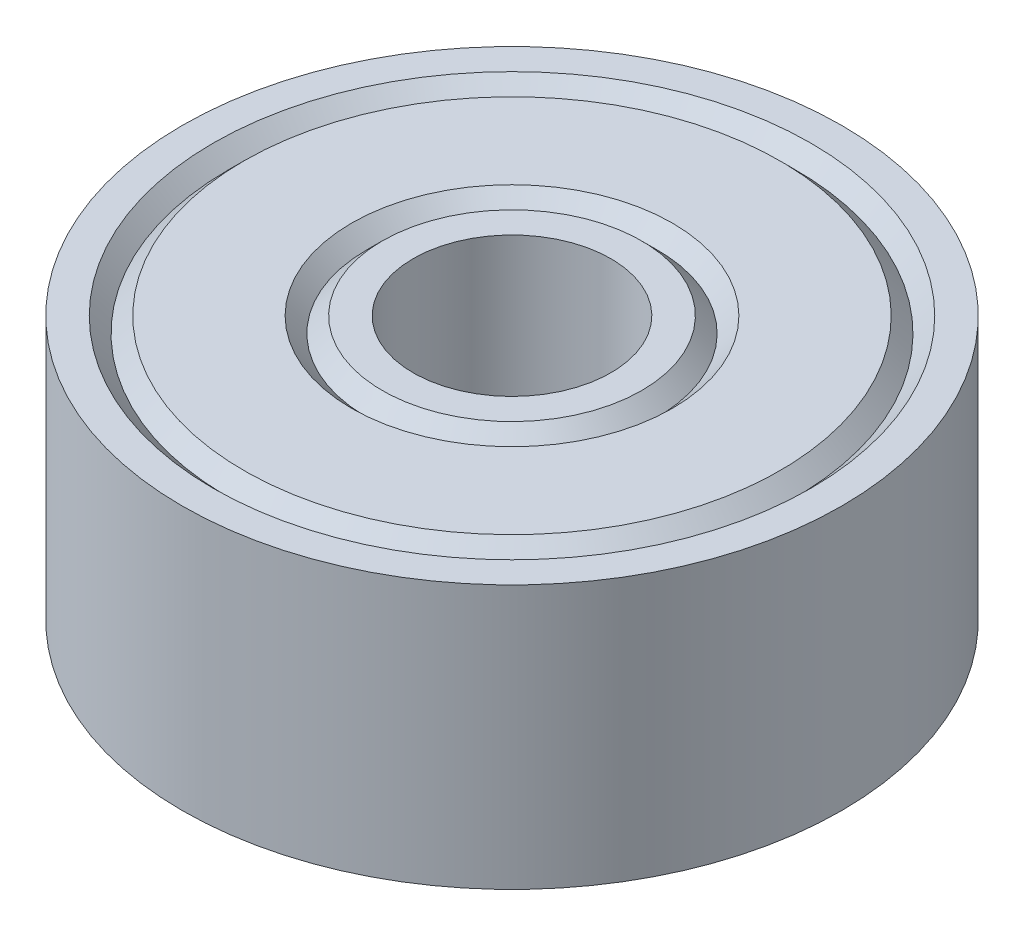
ISO-10303-21;
HEADER;
FILE_DESCRIPTION(('STEP AP214'),'2;1');
FILE_NAME('part.step','',(''),(''),'','','');
FILE_SCHEMA(('AUTOMOTIVE_DESIGN { 1 0 10303 214 1 1 1 1 }'));
ENDSEC;
DATA;
#1=APPLICATION_CONTEXT('core data for automotive mechanical design processes');
#2=APPLICATION_PROTOCOL_DEFINITION('international standard','automotive_design',2000,#1);
#3=PRODUCT_CONTEXT('',#1,'mechanical');
#4=PRODUCT('Part','Part','',(#3));
#5=PRODUCT_RELATED_PRODUCT_CATEGORY('part','',(#4));
#6=PRODUCT_DEFINITION_FORMATION('','',#4);
#7=PRODUCT_DEFINITION_CONTEXT('part definition',#1,'design');
#8=PRODUCT_DEFINITION('design','',#6,#7);
#9=PRODUCT_DEFINITION_SHAPE('','',#8);
#10=(LENGTH_UNIT() NAMED_UNIT(*) SI_UNIT(.MILLI.,.METRE.));
#11=(NAMED_UNIT(*) PLANE_ANGLE_UNIT() SI_UNIT($,.RADIAN.));
#12=(NAMED_UNIT(*) SI_UNIT($,.STERADIAN.) SOLID_ANGLE_UNIT());
#13=UNCERTAINTY_MEASURE_WITH_UNIT(LENGTH_MEASURE(1.E-05),#10,'distance_accuracy_value','');
#14=(GEOMETRIC_REPRESENTATION_CONTEXT(3) GLOBAL_UNCERTAINTY_ASSIGNED_CONTEXT((#13)) GLOBAL_UNIT_ASSIGNED_CONTEXT((#10,
#11,#12)) REPRESENTATION_CONTEXT('',''));
#15=CARTESIAN_POINT('',(0.,0.,0.));
#16=DIRECTION('',(0.,0.,1.));
#17=DIRECTION('',(1.,0.,0.));
#18=AXIS2_PLACEMENT_3D('',#15,#16,#17);
#19=CARTESIAN_POINT('',(0.,2.,0.));
#20=DIRECTION('',(0.,1.,0.));
#21=DIRECTION('',(-1.,0.,0.));
#22=AXIS2_PLACEMENT_3D('',#19,#20,#21);
#23=CYLINDRICAL_SURFACE('',#22,1.5);
#24=CARTESIAN_POINT('',(0.,2.,0.));
#25=DIRECTION('',(0.,1.,0.));
#26=DIRECTION('',(-1.,0.,0.));
#27=AXIS2_PLACEMENT_3D('',#24,#25,#26);
#28=CIRCLE('',#27,1.5);
#29=CARTESIAN_POINT('',(-1.5,2.,0.));
#30=VERTEX_POINT('',#29);
#31=EDGE_CURVE('E83',#30,#30,#28,.T.);
#32=ORIENTED_EDGE('',*,*,#31,.T.);
#33=EDGE_LOOP('',(#32));
#34=FACE_BOUND('',#33,.T.);
#35=CARTESIAN_POINT('',(0.,-2.,0.));
#36=DIRECTION('',(0.,1.,0.));
#37=DIRECTION('',(-1.,0.,0.));
#38=AXIS2_PLACEMENT_3D('',#35,#36,#37);
#39=CIRCLE('',#38,1.5);
#40=CARTESIAN_POINT('',(-1.5,-2.,0.));
#41=VERTEX_POINT('',#40);
#42=EDGE_CURVE('E10',#41,#41,#39,.T.);
#43=ORIENTED_EDGE('',*,*,#42,.F.);
#44=EDGE_LOOP('',(#43));
#45=FACE_BOUND('',#44,.T.);
#46=ADVANCED_FACE('F31',(#34,#45),#23,.F.);
#47=CARTESIAN_POINT('',(-1.5,-2.,0.));
#48=DIRECTION('',(0.,-1.,0.));
#49=DIRECTION('',(1.,0.,0.));
#50=AXIS2_PLACEMENT_3D('',#47,#48,#49);
#51=PLANE('',#50);
#52=ORIENTED_EDGE('',*,*,#42,.T.);
#53=EDGE_LOOP('',(#52));
#54=FACE_BOUND('',#53,.T.);
#55=CARTESIAN_POINT('',(0.,-2.,0.));
#56=DIRECTION('',(0.,1.,0.));
#57=DIRECTION('',(-1.,0.,0.));
#58=AXIS2_PLACEMENT_3D('',#55,#56,#57);
#59=CIRCLE('',#58,1.96666666666667);
#60=CARTESIAN_POINT('',(-1.96666666666667,-2.,0.));
#61=VERTEX_POINT('',#60);
#62=EDGE_CURVE('E37',#61,#61,#59,.T.);
#63=ORIENTED_EDGE('',*,*,#62,.F.);
#64=EDGE_LOOP('',(#63));
#65=FACE_BOUND('',#64,.T.);
#66=ADVANCED_FACE('F101',(#54,#65),#51,.T.);
#67=CARTESIAN_POINT('',(0.,-1.76666666666667,0.));
#68=DIRECTION('',(0.,1.,0.));
#69=DIRECTION('',(-1.,0.,0.));
#70=AXIS2_PLACEMENT_3D('',#67,#68,#69);
#71=CONICAL_SURFACE('',#70,2.2,0.785398163397452);
#72=ORIENTED_EDGE('',*,*,#62,.T.);
#73=EDGE_LOOP('',(#72));
#74=FACE_BOUND('',#73,.T.);
#75=CARTESIAN_POINT('',(0.,-1.76666666666667,0.));
#76=DIRECTION('',(0.,1.,0.));
#77=DIRECTION('',(-1.,0.,0.));
#78=AXIS2_PLACEMENT_3D('',#75,#76,#77);
#79=CIRCLE('',#78,2.2);
#80=CARTESIAN_POINT('',(-2.2,-1.76666666666667,0.));
#81=VERTEX_POINT('',#80);
#82=EDGE_CURVE('E41',#81,#81,#79,.T.);
#83=ORIENTED_EDGE('',*,*,#82,.F.);
#84=EDGE_LOOP('',(#83));
#85=FACE_BOUND('',#84,.T.);
#86=ADVANCED_FACE('F105',(#74,#85),#71,.T.);
#87=CARTESIAN_POINT('',(0.,-2.,0.));
#88=DIRECTION('',(0.,-1.,0.));
#89=DIRECTION('',(1.,0.,0.));
#90=AXIS2_PLACEMENT_3D('',#87,#88,#89);
#91=CONICAL_SURFACE('',#90,2.43333333333333,0.785398163397448);
#92=ORIENTED_EDGE('',*,*,#82,.T.);
#93=EDGE_LOOP('',(#92));
#94=FACE_BOUND('',#93,.T.);
#95=CARTESIAN_POINT('',(0.,-2.,0.));
#96=DIRECTION('',(0.,1.,0.));
#97=DIRECTION('',(-1.,0.,0.));
#98=AXIS2_PLACEMENT_3D('',#95,#96,#97);
#99=CIRCLE('',#98,2.43333333333333);
#100=CARTESIAN_POINT('',(-2.43333333333333,-2.,0.));
#101=VERTEX_POINT('',#100);
#102=EDGE_CURVE('E45',#101,#101,#99,.T.);
#103=ORIENTED_EDGE('',*,*,#102,.F.);
#104=EDGE_LOOP('',(#103));
#105=FACE_BOUND('',#104,.T.);
#106=ADVANCED_FACE('F109',(#94,#105),#91,.F.);
#107=CARTESIAN_POINT('',(-2.43333333333333,-2.,0.));
#108=DIRECTION('',(0.,-1.,0.));
#109=DIRECTION('',(1.,0.,0.));
#110=AXIS2_PLACEMENT_3D('',#107,#108,#109);
#111=PLANE('',#110);
#112=ORIENTED_EDGE('',*,*,#102,.T.);
#113=EDGE_LOOP('',(#112));
#114=FACE_BOUND('',#113,.T.);
#115=CARTESIAN_POINT('',(0.,-2.,0.));
#116=DIRECTION('',(0.,1.,0.));
#117=DIRECTION('',(-1.,0.,0.));
#118=AXIS2_PLACEMENT_3D('',#115,#116,#117);
#119=CIRCLE('',#118,4.06666666666667);
#120=CARTESIAN_POINT('',(-4.06666666666667,-2.,0.));
#121=VERTEX_POINT('',#120);
#122=EDGE_CURVE('E50',#121,#121,#119,.T.);
#123=ORIENTED_EDGE('',*,*,#122,.F.);
#124=EDGE_LOOP('',(#123));
#125=FACE_BOUND('',#124,.T.);
#126=ADVANCED_FACE('F115',(#114,#125),#111,.T.);
#127=CARTESIAN_POINT('',(0.,-1.76666666666667,0.));
#128=DIRECTION('',(0.,1.,0.));
#129=DIRECTION('',(-1.,0.,0.));
#130=AXIS2_PLACEMENT_3D('',#127,#128,#129);
#131=CONICAL_SURFACE('',#130,4.3,0.785398163397447);
#132=ORIENTED_EDGE('',*,*,#122,.T.);
#133=EDGE_LOOP('',(#132));
#134=FACE_BOUND('',#133,.T.);
#135=CARTESIAN_POINT('',(0.,-1.76666666666667,0.));
#136=DIRECTION('',(0.,1.,0.));
#137=DIRECTION('',(-1.,0.,0.));
#138=AXIS2_PLACEMENT_3D('',#135,#136,#137);
#139=CIRCLE('',#138,4.3);
#140=CARTESIAN_POINT('',(-4.3,-1.76666666666667,0.));
#141=VERTEX_POINT('',#140);
#142=EDGE_CURVE('E53',#141,#141,#139,.T.);
#143=ORIENTED_EDGE('',*,*,#142,.F.);
#144=EDGE_LOOP('',(#143));
#145=FACE_BOUND('',#144,.T.);
#146=ADVANCED_FACE('F119',(#134,#145),#131,.T.);
#147=CARTESIAN_POINT('',(0.,-2.,0.));
#148=DIRECTION('',(0.,-1.,0.));
#149=DIRECTION('',(1.,0.,0.));
#150=AXIS2_PLACEMENT_3D('',#147,#148,#149);
#151=CONICAL_SURFACE('',#150,4.53333333333333,0.785398163397448);
#152=ORIENTED_EDGE('',*,*,#142,.T.);
#153=EDGE_LOOP('',(#152));
#154=FACE_BOUND('',#153,.T.);
#155=CARTESIAN_POINT('',(0.,-2.,0.));
#156=DIRECTION('',(0.,1.,0.));
#157=DIRECTION('',(-1.,0.,0.));
#158=AXIS2_PLACEMENT_3D('',#155,#156,#157);
#159=CIRCLE('',#158,4.53333333333333);
#160=CARTESIAN_POINT('',(-4.53333333333333,-2.,0.));
#161=VERTEX_POINT('',#160);
#162=EDGE_CURVE('E56',#161,#161,#159,.T.);
#163=ORIENTED_EDGE('',*,*,#162,.F.);
#164=EDGE_LOOP('',(#163));
#165=FACE_BOUND('',#164,.T.);
#166=ADVANCED_FACE('F123',(#154,#165),#151,.F.);
#167=CARTESIAN_POINT('',(-4.53333333333333,-2.,0.));
#168=DIRECTION('',(0.,-1.,0.));
#169=DIRECTION('',(1.,0.,0.));
#170=AXIS2_PLACEMENT_3D('',#167,#168,#169);
#171=PLANE('',#170);
#172=ORIENTED_EDGE('',*,*,#162,.T.);
#173=EDGE_LOOP('',(#172));
#174=FACE_BOUND('',#173,.T.);
#175=CARTESIAN_POINT('',(0.,-2.,0.));
#176=DIRECTION('',(0.,1.,0.));
#177=DIRECTION('',(-1.,0.,0.));
#178=AXIS2_PLACEMENT_3D('',#175,#176,#177);
#179=CIRCLE('',#178,5.);
#180=CARTESIAN_POINT('',(-5.,-2.,0.));
#181=VERTEX_POINT('',#180);
#182=EDGE_CURVE('E59',#181,#181,#179,.T.);
#183=ORIENTED_EDGE('',*,*,#182,.F.);
#184=EDGE_LOOP('',(#183));
#185=FACE_BOUND('',#184,.T.);
#186=ADVANCED_FACE('F127',(#174,#185),#171,.T.);
#187=CARTESIAN_POINT('',(0.,2.,0.));
#188=DIRECTION('',(0.,1.,0.));
#189=DIRECTION('',(-1.,0.,0.));
#190=AXIS2_PLACEMENT_3D('',#187,#188,#189);
#191=CYLINDRICAL_SURFACE('',#190,5.);
#192=ORIENTED_EDGE('',*,*,#182,.T.);
#193=EDGE_LOOP('',(#192));
#194=FACE_BOUND('',#193,.T.);
#195=CARTESIAN_POINT('',(0.,2.,0.));
#196=DIRECTION('',(0.,1.,0.));
#197=DIRECTION('',(-1.,0.,0.));
#198=AXIS2_PLACEMENT_3D('',#195,#196,#197);
#199=CIRCLE('',#198,5.);
#200=CARTESIAN_POINT('',(-5.,2.,0.));
#201=VERTEX_POINT('',#200);
#202=EDGE_CURVE('E62',#201,#201,#199,.T.);
#203=ORIENTED_EDGE('',*,*,#202,.F.);
#204=EDGE_LOOP('',(#203));
#205=FACE_BOUND('',#204,.T.);
#206=ADVANCED_FACE('F131',(#194,#205),#191,.T.);
#207=CARTESIAN_POINT('',(-4.53333333333333,2.,0.));
#208=DIRECTION('',(0.,1.,0.));
#209=DIRECTION('',(-1.,0.,0.));
#210=AXIS2_PLACEMENT_3D('',#207,#208,#209);
#211=PLANE('',#210);
#212=ORIENTED_EDGE('',*,*,#202,.T.);
#213=EDGE_LOOP('',(#212));
#214=FACE_BOUND('',#213,.T.);
#215=CARTESIAN_POINT('',(0.,2.,0.));
#216=DIRECTION('',(0.,1.,0.));
#217=DIRECTION('',(-1.,0.,0.));
#218=AXIS2_PLACEMENT_3D('',#215,#216,#217);
#219=CIRCLE('',#218,4.53333333333333);
#220=CARTESIAN_POINT('',(-4.53333333333333,2.,0.));
#221=VERTEX_POINT('',#220);
#222=EDGE_CURVE('E65',#221,#221,#219,.T.);
#223=ORIENTED_EDGE('',*,*,#222,.F.);
#224=EDGE_LOOP('',(#223));
#225=FACE_BOUND('',#224,.T.);
#226=ADVANCED_FACE('F135',(#214,#225),#211,.T.);
#227=CARTESIAN_POINT('',(0.,1.76666666666667,0.));
#228=DIRECTION('',(0.,1.,0.));
#229=DIRECTION('',(-1.,0.,0.));
#230=AXIS2_PLACEMENT_3D('',#227,#228,#229);
#231=CONICAL_SURFACE('',#230,4.3,0.785398163397449);
#232=ORIENTED_EDGE('',*,*,#222,.T.);
#233=EDGE_LOOP('',(#232));
#234=FACE_BOUND('',#233,.T.);
#235=CARTESIAN_POINT('',(0.,1.76666666666667,0.));
#236=DIRECTION('',(0.,1.,0.));
#237=DIRECTION('',(-1.,0.,0.));
#238=AXIS2_PLACEMENT_3D('',#235,#236,#237);
#239=CIRCLE('',#238,4.3);
#240=CARTESIAN_POINT('',(-4.3,1.76666666666667,0.));
#241=VERTEX_POINT('',#240);
#242=EDGE_CURVE('E68',#241,#241,#239,.T.);
#243=ORIENTED_EDGE('',*,*,#242,.F.);
#244=EDGE_LOOP('',(#243));
#245=FACE_BOUND('',#244,.T.);
#246=ADVANCED_FACE('F139',(#234,#245),#231,.F.);
#247=CARTESIAN_POINT('',(0.,2.,0.));
#248=DIRECTION('',(0.,-1.,0.));
#249=DIRECTION('',(1.,0.,0.));
#250=AXIS2_PLACEMENT_3D('',#247,#248,#249);
#251=CONICAL_SURFACE('',#250,4.06666666666667,0.785398163397449);
#252=ORIENTED_EDGE('',*,*,#242,.T.);
#253=EDGE_LOOP('',(#252));
#254=FACE_BOUND('',#253,.T.);
#255=CARTESIAN_POINT('',(0.,2.,0.));
#256=DIRECTION('',(0.,1.,0.));
#257=DIRECTION('',(-1.,0.,0.));
#258=AXIS2_PLACEMENT_3D('',#255,#256,#257);
#259=CIRCLE('',#258,4.06666666666667);
#260=CARTESIAN_POINT('',(-4.06666666666667,2.,0.));
#261=VERTEX_POINT('',#260);
#262=EDGE_CURVE('E71',#261,#261,#259,.T.);
#263=ORIENTED_EDGE('',*,*,#262,.F.);
#264=EDGE_LOOP('',(#263));
#265=FACE_BOUND('',#264,.T.);
#266=ADVANCED_FACE('F143',(#254,#265),#251,.T.);
#267=CARTESIAN_POINT('',(-2.43333333333333,2.,0.));
#268=DIRECTION('',(0.,1.,0.));
#269=DIRECTION('',(-1.,0.,0.));
#270=AXIS2_PLACEMENT_3D('',#267,#268,#269);
#271=PLANE('',#270);
#272=ORIENTED_EDGE('',*,*,#262,.T.);
#273=EDGE_LOOP('',(#272));
#274=FACE_BOUND('',#273,.T.);
#275=CARTESIAN_POINT('',(0.,2.,0.));
#276=DIRECTION('',(0.,1.,0.));
#277=DIRECTION('',(-1.,0.,0.));
#278=AXIS2_PLACEMENT_3D('',#275,#276,#277);
#279=CIRCLE('',#278,2.43333333333333);
#280=CARTESIAN_POINT('',(-2.43333333333333,2.,0.));
#281=VERTEX_POINT('',#280);
#282=EDGE_CURVE('E74',#281,#281,#279,.T.);
#283=ORIENTED_EDGE('',*,*,#282,.F.);
#284=EDGE_LOOP('',(#283));
#285=FACE_BOUND('',#284,.T.);
#286=ADVANCED_FACE('F147',(#274,#285),#271,.T.);
#287=CARTESIAN_POINT('',(0.,1.76666666666667,0.));
#288=DIRECTION('',(0.,1.,0.));
#289=DIRECTION('',(-1.,0.,0.));
#290=AXIS2_PLACEMENT_3D('',#287,#288,#289);
#291=CONICAL_SURFACE('',#290,2.2,0.785398163397447);
#292=ORIENTED_EDGE('',*,*,#282,.T.);
#293=EDGE_LOOP('',(#292));
#294=FACE_BOUND('',#293,.T.);
#295=CARTESIAN_POINT('',(0.,1.76666666666667,0.));
#296=DIRECTION('',(0.,1.,0.));
#297=DIRECTION('',(-1.,0.,0.));
#298=AXIS2_PLACEMENT_3D('',#295,#296,#297);
#299=CIRCLE('',#298,2.2);
#300=CARTESIAN_POINT('',(-2.2,1.76666666666667,0.));
#301=VERTEX_POINT('',#300);
#302=EDGE_CURVE('E77',#301,#301,#299,.T.);
#303=ORIENTED_EDGE('',*,*,#302,.F.);
#304=EDGE_LOOP('',(#303));
#305=FACE_BOUND('',#304,.T.);
#306=ADVANCED_FACE('F97',(#294,#305),#291,.F.);
#307=CARTESIAN_POINT('',(0.,2.,0.));
#308=DIRECTION('',(0.,-1.,0.));
#309=DIRECTION('',(1.,0.,0.));
#310=AXIS2_PLACEMENT_3D('',#307,#308,#309);
#311=CONICAL_SURFACE('',#310,1.96666666666667,0.785398163397449);
#312=ORIENTED_EDGE('',*,*,#302,.T.);
#313=EDGE_LOOP('',(#312));
#314=FACE_BOUND('',#313,.T.);
#315=CARTESIAN_POINT('',(0.,2.,0.));
#316=DIRECTION('',(0.,1.,0.));
#317=DIRECTION('',(-1.,0.,0.));
#318=AXIS2_PLACEMENT_3D('',#315,#316,#317);
#319=CIRCLE('',#318,1.96666666666667);
#320=CARTESIAN_POINT('',(-1.96666666666667,2.,0.));
#321=VERTEX_POINT('',#320);
#322=EDGE_CURVE('E80',#321,#321,#319,.T.);
#323=ORIENTED_EDGE('',*,*,#322,.F.);
#324=EDGE_LOOP('',(#323));
#325=FACE_BOUND('',#324,.T.);
#326=ADVANCED_FACE('F91',(#314,#325),#311,.T.);
#327=CARTESIAN_POINT('',(-1.5,2.,0.));
#328=DIRECTION('',(0.,1.,0.));
#329=DIRECTION('',(-1.,0.,0.));
#330=AXIS2_PLACEMENT_3D('',#327,#328,#329);
#331=PLANE('',#330);
#332=ORIENTED_EDGE('',*,*,#322,.T.);
#333=EDGE_LOOP('',(#332));
#334=FACE_BOUND('',#333,.T.);
#335=ORIENTED_EDGE('',*,*,#31,.F.);
#336=EDGE_LOOP('',(#335));
#337=FACE_BOUND('',#336,.T.);
#338=ADVANCED_FACE('F89',(#334,#337),#331,.T.);
#339=CLOSED_SHELL('',(#46,#66,#86,#106,#126,#146,#166,#186,#206,#226,#246,#266,#286,#306,#326,#338));
#340=MANIFOLD_SOLID_BREP('B2',#339);
#341=ADVANCED_BREP_SHAPE_REPRESENTATION('',(#18,#340),#14);
#342=SHAPE_DEFINITION_REPRESENTATION(#9,#341);
ENDSEC;
END-ISO-10303-21;
